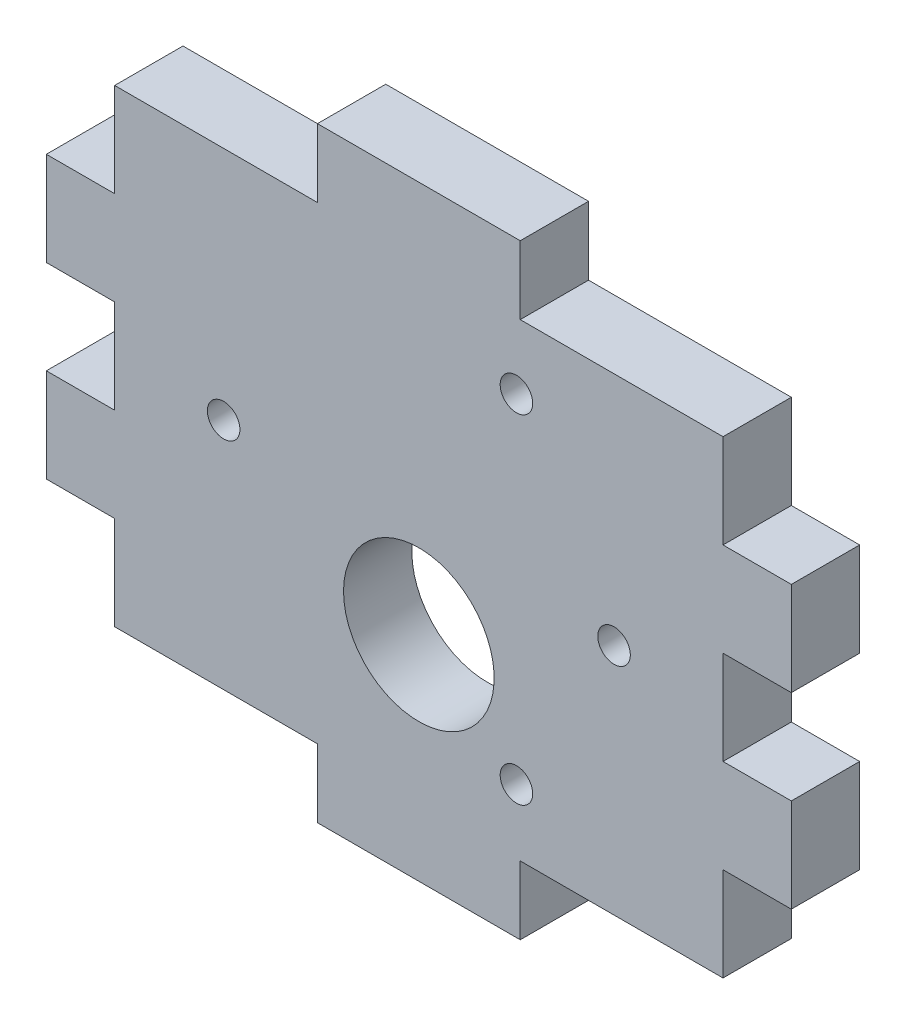
ISO-10303-21;
HEADER;
FILE_DESCRIPTION(('STEP AP214'),'2;1');
FILE_NAME('part.step','',(''),(''),'','','');
FILE_SCHEMA(('AUTOMOTIVE_DESIGN { 1 0 10303 214 1 1 1 1 }'));
ENDSEC;
DATA;
#1=APPLICATION_CONTEXT('core data for automotive mechanical design processes');
#2=APPLICATION_PROTOCOL_DEFINITION('international standard','automotive_design',2000,#1);
#3=PRODUCT_CONTEXT('',#1,'mechanical');
#4=PRODUCT('Part','Part','',(#3));
#5=PRODUCT_RELATED_PRODUCT_CATEGORY('part','',(#4));
#6=PRODUCT_DEFINITION_FORMATION('','',#4);
#7=PRODUCT_DEFINITION_CONTEXT('part definition',#1,'design');
#8=PRODUCT_DEFINITION('design','',#6,#7);
#9=PRODUCT_DEFINITION_SHAPE('','',#8);
#10=(LENGTH_UNIT() NAMED_UNIT(*) SI_UNIT(.MILLI.,.METRE.));
#11=(NAMED_UNIT(*) PLANE_ANGLE_UNIT() SI_UNIT($,.RADIAN.));
#12=(NAMED_UNIT(*) SI_UNIT($,.STERADIAN.) SOLID_ANGLE_UNIT());
#13=UNCERTAINTY_MEASURE_WITH_UNIT(LENGTH_MEASURE(1.E-05),#10,'distance_accuracy_value','');
#14=(GEOMETRIC_REPRESENTATION_CONTEXT(3) GLOBAL_UNCERTAINTY_ASSIGNED_CONTEXT((#13)) GLOBAL_UNIT_ASSIGNED_CONTEXT((#10,
#11,#12)) REPRESENTATION_CONTEXT('',''));
#15=CARTESIAN_POINT('',(0.,0.,0.));
#16=DIRECTION('',(0.,0.,1.));
#17=DIRECTION('',(1.,0.,0.));
#18=AXIS2_PLACEMENT_3D('',#15,#16,#17);
#19=CARTESIAN_POINT('',(-23.749,18.3007,2.667));
#20=DIRECTION('',(0.,-1.,0.));
#21=DIRECTION('',(0.,0.,-1.));
#22=AXIS2_PLACEMENT_3D('',#19,#20,#21);
#23=PLANE('',#22);
#24=DIRECTION('',(0.,0.,1.));
#25=VECTOR('',#24,1.);
#26=CARTESIAN_POINT('',(-7.91633333333333,18.3007,-2.667));
#27=LINE('',#26,#25);
#28=CARTESIAN_POINT('',(-7.91633333333333,18.3007,-2.667));
#29=VERTEX_POINT('',#28);
#30=CARTESIAN_POINT('',(-7.91633333333333,18.3007,2.667));
#31=VERTEX_POINT('',#30);
#32=EDGE_CURVE('E502',#29,#31,#27,.T.);
#33=ORIENTED_EDGE('',*,*,#32,.F.);
#34=DIRECTION('',(-1.,0.,0.));
#35=VECTOR('',#34,1.);
#36=CARTESIAN_POINT('',(-23.749,18.3007,-2.667));
#37=LINE('',#36,#35);
#38=CARTESIAN_POINT('',(-23.749,18.3007,-2.667));
#39=VERTEX_POINT('',#38);
#40=EDGE_CURVE('E243',#29,#39,#37,.T.);
#41=ORIENTED_EDGE('',*,*,#40,.T.);
#42=DIRECTION('',(0.,0.,-1.));
#43=VECTOR('',#42,1.);
#44=CARTESIAN_POINT('',(-23.749,18.3007,2.667));
#45=LINE('',#44,#43);
#46=CARTESIAN_POINT('',(-23.749,18.3007,2.667));
#47=VERTEX_POINT('',#46);
#48=EDGE_CURVE('E42',#47,#39,#45,.T.);
#49=ORIENTED_EDGE('',*,*,#48,.F.);
#50=DIRECTION('',(-1.,0.,0.));
#51=VECTOR('',#50,1.);
#52=CARTESIAN_POINT('',(-23.749,18.3007,2.667));
#53=LINE('',#52,#51);
#54=EDGE_CURVE('E319',#31,#47,#53,.T.);
#55=ORIENTED_EDGE('',*,*,#54,.F.);
#56=EDGE_LOOP('',(#33,#41,#49,#55));
#57=FACE_BOUND('',#56,.T.);
#58=ADVANCED_FACE('F33',(#57),#23,.F.);
#59=CARTESIAN_POINT('',(-23.749,-18.3007,2.667));
#60=DIRECTION('',(0.,1.,0.));
#61=DIRECTION('',(0.,0.,1.));
#62=AXIS2_PLACEMENT_3D('',#59,#60,#61);
#63=PLANE('',#62);
#64=DIRECTION('',(0.,0.,1.));
#65=VECTOR('',#64,1.);
#66=CARTESIAN_POINT('',(7.91633333333334,-18.3007,-2.667));
#67=LINE('',#66,#65);
#68=CARTESIAN_POINT('',(7.91633333333334,-18.3007,-2.667));
#69=VERTEX_POINT('',#68);
#70=CARTESIAN_POINT('',(7.91633333333334,-18.3007,2.667));
#71=VERTEX_POINT('',#70);
#72=EDGE_CURVE('E350',#69,#71,#67,.T.);
#73=ORIENTED_EDGE('',*,*,#72,.F.);
#74=DIRECTION('',(1.,0.,0.));
#75=VECTOR('',#74,1.);
#76=CARTESIAN_POINT('',(-23.749,-18.3007,-2.667));
#77=LINE('',#76,#75);
#78=CARTESIAN_POINT('',(23.749,-18.3007,-2.667));
#79=VERTEX_POINT('',#78);
#80=EDGE_CURVE('E271',#69,#79,#77,.T.);
#81=ORIENTED_EDGE('',*,*,#80,.T.);
#82=DIRECTION('',(0.,0.,-1.));
#83=VECTOR('',#82,1.);
#84=CARTESIAN_POINT('',(23.749,-18.3007,2.667));
#85=LINE('',#84,#83);
#86=CARTESIAN_POINT('',(23.749,-18.3007,2.667));
#87=VERTEX_POINT('',#86);
#88=EDGE_CURVE('E277',#87,#79,#85,.T.);
#89=ORIENTED_EDGE('',*,*,#88,.F.);
#90=DIRECTION('',(1.,0.,0.));
#91=VECTOR('',#90,1.);
#92=CARTESIAN_POINT('',(-23.749,-18.3007,2.667));
#93=LINE('',#92,#91);
#94=EDGE_CURVE('E285',#71,#87,#93,.T.);
#95=ORIENTED_EDGE('',*,*,#94,.F.);
#96=EDGE_LOOP('',(#73,#81,#89,#95));
#97=FACE_BOUND('',#96,.T.);
#98=ADVANCED_FACE('F348',(#97),#63,.F.);
#99=CARTESIAN_POINT('',(23.749,-18.3007,2.667));
#100=DIRECTION('',(-1.,0.,0.));
#101=DIRECTION('',(0.,0.,1.));
#102=AXIS2_PLACEMENT_3D('',#99,#100,#101);
#103=PLANE('',#102);
#104=DIRECTION('',(0.,1.,0.));
#105=VECTOR('',#104,1.);
#106=CARTESIAN_POINT('',(23.749,-18.3007,2.667));
#107=LINE('',#106,#105);
#108=CARTESIAN_POINT('',(23.749,10.98042,2.667));
#109=VERTEX_POINT('',#108);
#110=CARTESIAN_POINT('',(23.749,18.3007,2.667));
#111=VERTEX_POINT('',#110);
#112=EDGE_CURVE('E338',#109,#111,#107,.T.);
#113=ORIENTED_EDGE('',*,*,#112,.F.);
#114=DIRECTION('',(0.,0.,1.));
#115=VECTOR('',#114,1.);
#116=CARTESIAN_POINT('',(23.749,10.98042,-2.667));
#117=LINE('',#116,#115);
#118=CARTESIAN_POINT('',(23.749,10.98042,-2.667));
#119=VERTEX_POINT('',#118);
#120=EDGE_CURVE('E416',#119,#109,#117,.T.);
#121=ORIENTED_EDGE('',*,*,#120,.F.);
#122=DIRECTION('',(0.,1.,0.));
#123=VECTOR('',#122,1.);
#124=CARTESIAN_POINT('',(23.749,-18.3007,-2.667));
#125=LINE('',#124,#123);
#126=CARTESIAN_POINT('',(23.749,18.3007,-2.667));
#127=VERTEX_POINT('',#126);
#128=EDGE_CURVE('E325',#119,#127,#125,.T.);
#129=ORIENTED_EDGE('',*,*,#128,.T.);
#130=DIRECTION('',(0.,0.,-1.));
#131=VECTOR('',#130,1.);
#132=CARTESIAN_POINT('',(23.749,18.3007,2.667));
#133=LINE('',#132,#131);
#134=EDGE_CURVE('E11',#111,#127,#133,.T.);
#135=ORIENTED_EDGE('',*,*,#134,.F.);
#136=EDGE_LOOP('',(#113,#121,#129,#135));
#137=FACE_BOUND('',#136,.T.);
#138=ADVANCED_FACE('F474',(#137),#103,.F.);
#139=CARTESIAN_POINT('',(23.749,-3.66014,-2.667));
#140=VERTEX_POINT('',#139);
#141=CARTESIAN_POINT('',(23.749,3.66014,-2.667));
#142=VERTEX_POINT('',#141);
#143=EDGE_CURVE('E323',#140,#142,#125,.T.);
#144=ORIENTED_EDGE('',*,*,#143,.T.);
#145=DIRECTION('',(0.,0.,1.));
#146=VECTOR('',#145,1.);
#147=CARTESIAN_POINT('',(23.749,3.66014,-2.667));
#148=LINE('',#147,#146);
#149=CARTESIAN_POINT('',(23.749,3.66014,2.667));
#150=VERTEX_POINT('',#149);
#151=EDGE_CURVE('E407',#142,#150,#148,.T.);
#152=ORIENTED_EDGE('',*,*,#151,.T.);
#153=CARTESIAN_POINT('',(23.749,-3.66014,2.667));
#154=VERTEX_POINT('',#153);
#155=EDGE_CURVE('E329',#154,#150,#107,.T.);
#156=ORIENTED_EDGE('',*,*,#155,.F.);
#157=DIRECTION('',(0.,0.,1.));
#158=VECTOR('',#157,1.);
#159=CARTESIAN_POINT('',(23.749,-3.66014,-2.667));
#160=LINE('',#159,#158);
#161=EDGE_CURVE('E363',#140,#154,#160,.T.);
#162=ORIENTED_EDGE('',*,*,#161,.F.);
#163=EDGE_LOOP('',(#144,#152,#156,#162));
#164=FACE_BOUND('',#163,.T.);
#165=ADVANCED_FACE('F457',(#164),#103,.F.);
#166=CARTESIAN_POINT('',(-23.749,-18.3007,2.667));
#167=DIRECTION('',(1.,0.,0.));
#168=DIRECTION('',(0.,0.,-1.));
#169=AXIS2_PLACEMENT_3D('',#166,#167,#168);
#170=PLANE('',#169);
#171=DIRECTION('',(0.,-1.,0.));
#172=VECTOR('',#171,1.);
#173=CARTESIAN_POINT('',(-23.749,-18.3007,2.667));
#174=LINE('',#173,#172);
#175=CARTESIAN_POINT('',(-23.749,-10.98042,2.667));
#176=VERTEX_POINT('',#175);
#177=CARTESIAN_POINT('',(-23.749,-18.3007,2.667));
#178=VERTEX_POINT('',#177);
#179=EDGE_CURVE('E311',#176,#178,#174,.T.);
#180=ORIENTED_EDGE('',*,*,#179,.F.);
#181=DIRECTION('',(0.,0.,1.));
#182=VECTOR('',#181,1.);
#183=CARTESIAN_POINT('',(-23.749,-10.98042,-2.667));
#184=LINE('',#183,#182);
#185=CARTESIAN_POINT('',(-23.749,-10.98042,-2.667));
#186=VERTEX_POINT('',#185);
#187=EDGE_CURVE('E602',#186,#176,#184,.T.);
#188=ORIENTED_EDGE('',*,*,#187,.F.);
#189=DIRECTION('',(0.,-1.,0.));
#190=VECTOR('',#189,1.);
#191=CARTESIAN_POINT('',(-23.749,-18.3007,-2.667));
#192=LINE('',#191,#190);
#193=CARTESIAN_POINT('',(-23.749,-18.3007,-2.667));
#194=VERTEX_POINT('',#193);
#195=EDGE_CURVE('E242',#186,#194,#192,.T.);
#196=ORIENTED_EDGE('',*,*,#195,.T.);
#197=DIRECTION('',(0.,0.,-1.));
#198=VECTOR('',#197,1.);
#199=CARTESIAN_POINT('',(-23.749,-18.3007,2.667));
#200=LINE('',#199,#198);
#201=EDGE_CURVE('E275',#178,#194,#200,.T.);
#202=ORIENTED_EDGE('',*,*,#201,.F.);
#203=EDGE_LOOP('',(#180,#188,#196,#202));
#204=FACE_BOUND('',#203,.T.);
#205=ADVANCED_FACE('F586',(#204),#170,.F.);
#206=CARTESIAN_POINT('',(-23.749,3.66014,-2.667));
#207=VERTEX_POINT('',#206);
#208=CARTESIAN_POINT('',(-23.749,-3.66014,-2.667));
#209=VERTEX_POINT('',#208);
#210=EDGE_CURVE('E245',#207,#209,#192,.T.);
#211=ORIENTED_EDGE('',*,*,#210,.T.);
#212=DIRECTION('',(0.,0.,1.));
#213=VECTOR('',#212,1.);
#214=CARTESIAN_POINT('',(-23.749,-3.66014,-2.667));
#215=LINE('',#214,#213);
#216=CARTESIAN_POINT('',(-23.749,-3.66014,2.667));
#217=VERTEX_POINT('',#216);
#218=EDGE_CURVE('E627',#209,#217,#215,.T.);
#219=ORIENTED_EDGE('',*,*,#218,.T.);
#220=CARTESIAN_POINT('',(-23.749,3.66014,2.667));
#221=VERTEX_POINT('',#220);
#222=EDGE_CURVE('E304',#221,#217,#174,.T.);
#223=ORIENTED_EDGE('',*,*,#222,.F.);
#224=DIRECTION('',(0.,0.,1.));
#225=VECTOR('',#224,1.);
#226=CARTESIAN_POINT('',(-23.749,3.66014,-2.667));
#227=LINE('',#226,#225);
#228=EDGE_CURVE('E642',#207,#221,#227,.T.);
#229=ORIENTED_EDGE('',*,*,#228,.F.);
#230=EDGE_LOOP('',(#211,#219,#223,#229));
#231=FACE_BOUND('',#230,.T.);
#232=ADVANCED_FACE('F587',(#231),#170,.F.);
#233=CARTESIAN_POINT('',(23.749,-10.98042,-2.667));
#234=VERTEX_POINT('',#233);
#235=EDGE_CURVE('E247',#79,#234,#125,.T.);
#236=ORIENTED_EDGE('',*,*,#235,.T.);
#237=DIRECTION('',(0.,0.,1.));
#238=VECTOR('',#237,1.);
#239=CARTESIAN_POINT('',(23.749,-10.98042,-2.667));
#240=LINE('',#239,#238);
#241=CARTESIAN_POINT('',(23.749,-10.98042,2.667));
#242=VERTEX_POINT('',#241);
#243=EDGE_CURVE('E360',#234,#242,#240,.T.);
#244=ORIENTED_EDGE('',*,*,#243,.T.);
#245=EDGE_CURVE('E326',#87,#242,#107,.T.);
#246=ORIENTED_EDGE('',*,*,#245,.F.);
#247=ORIENTED_EDGE('',*,*,#88,.T.);
#248=EDGE_LOOP('',(#236,#244,#246,#247));
#249=FACE_BOUND('',#248,.T.);
#250=ADVANCED_FACE('F35',(#249),#103,.F.);
#251=CARTESIAN_POINT('',(7.91633333333334,18.3007,-2.667));
#252=VERTEX_POINT('',#251);
#253=EDGE_CURVE('E234',#127,#252,#37,.T.);
#254=ORIENTED_EDGE('',*,*,#253,.T.);
#255=DIRECTION('',(0.,0.,1.));
#256=VECTOR('',#255,1.);
#257=CARTESIAN_POINT('',(7.91633333333334,18.3007,-2.667));
#258=LINE('',#257,#256);
#259=CARTESIAN_POINT('',(7.91633333333331,18.3007,2.667));
#260=VERTEX_POINT('',#259);
#261=EDGE_CURVE('E218',#252,#260,#258,.T.);
#262=ORIENTED_EDGE('',*,*,#261,.T.);
#263=EDGE_CURVE('E316',#111,#260,#53,.T.);
#264=ORIENTED_EDGE('',*,*,#263,.F.);
#265=ORIENTED_EDGE('',*,*,#134,.T.);
#266=EDGE_LOOP('',(#254,#262,#264,#265));
#267=FACE_BOUND('',#266,.T.);
#268=ADVANCED_FACE('F240',(#267),#23,.F.);
#269=CARTESIAN_POINT('',(-23.749,10.98042,-2.667));
#270=VERTEX_POINT('',#269);
#271=EDGE_CURVE('E269',#39,#270,#192,.T.);
#272=ORIENTED_EDGE('',*,*,#271,.T.);
#273=DIRECTION('',(0.,0.,1.));
#274=VECTOR('',#273,1.);
#275=CARTESIAN_POINT('',(-23.749,10.98042,-2.667));
#276=LINE('',#275,#274);
#277=CARTESIAN_POINT('',(-23.749,10.98042,2.667));
#278=VERTEX_POINT('',#277);
#279=EDGE_CURVE('E648',#270,#278,#276,.T.);
#280=ORIENTED_EDGE('',*,*,#279,.T.);
#281=EDGE_CURVE('E289',#47,#278,#174,.T.);
#282=ORIENTED_EDGE('',*,*,#281,.F.);
#283=ORIENTED_EDGE('',*,*,#48,.T.);
#284=EDGE_LOOP('',(#272,#280,#282,#283));
#285=FACE_BOUND('',#284,.T.);
#286=ADVANCED_FACE('F570',(#285),#170,.F.);
#287=CARTESIAN_POINT('',(-7.91633333333333,-18.3007,-2.667));
#288=VERTEX_POINT('',#287);
#289=EDGE_CURVE('E340',#194,#288,#77,.T.);
#290=ORIENTED_EDGE('',*,*,#289,.T.);
#291=DIRECTION('',(0.,0.,1.));
#292=VECTOR('',#291,1.);
#293=CARTESIAN_POINT('',(-7.91633333333333,-18.3007,-2.667));
#294=LINE('',#293,#292);
#295=CARTESIAN_POINT('',(-7.91633333333334,-18.3007,2.667));
#296=VERTEX_POINT('',#295);
#297=EDGE_CURVE('E388',#288,#296,#294,.T.);
#298=ORIENTED_EDGE('',*,*,#297,.T.);
#299=EDGE_CURVE('E279',#178,#296,#93,.T.);
#300=ORIENTED_EDGE('',*,*,#299,.F.);
#301=ORIENTED_EDGE('',*,*,#201,.T.);
#302=EDGE_LOOP('',(#290,#298,#300,#301));
#303=FACE_BOUND('',#302,.T.);
#304=ADVANCED_FACE('F564',(#303),#63,.F.);
#305=CARTESIAN_POINT('',(23.749,18.3007,2.667));
#306=DIRECTION('',(0.,0.,-1.));
#307=DIRECTION('',(-1.,0.,0.));
#308=AXIS2_PLACEMENT_3D('',#305,#306,#307);
#309=PLANE('',#308);
#310=CARTESIAN_POINT('',(15.2399999999999,-0.0761999999999998,2.667));
#311=DIRECTION('',(0.,0.,-1.));
#312=DIRECTION('',(-1.,0.,0.));
#313=AXIS2_PLACEMENT_3D('',#310,#311,#312);
#314=CIRCLE('',#313,1.27);
#315=CARTESIAN_POINT('',(13.9699999999999,-0.0761999999999998,2.667));
#316=VERTEX_POINT('',#315);
#317=EDGE_CURVE('E534',#316,#316,#314,.T.);
#318=ORIENTED_EDGE('',*,*,#317,.T.);
#319=EDGE_LOOP('',(#318));
#320=FACE_BOUND('',#319,.T.);
#321=CARTESIAN_POINT('',(7.61999995005207,13.1220271825123,2.667));
#322=DIRECTION('',(0.,0.,-1.));
#323=DIRECTION('',(-1.,0.,0.));
#324=AXIS2_PLACEMENT_3D('',#321,#322,#323);
#325=CIRCLE('',#324,1.27);
#326=CARTESIAN_POINT('',(6.34999995005207,13.1220271825123,2.667));
#327=VERTEX_POINT('',#326);
#328=EDGE_CURVE('E528',#327,#327,#325,.T.);
#329=ORIENTED_EDGE('',*,*,#328,.T.);
#330=EDGE_LOOP('',(#329));
#331=FACE_BOUND('',#330,.T.);
#332=CARTESIAN_POINT('',(7.61999999999999,-13.274427096,2.667));
#333=DIRECTION('',(0.,0.,-1.));
#334=DIRECTION('',(-1.,0.,0.));
#335=AXIS2_PLACEMENT_3D('',#332,#333,#334);
#336=CIRCLE('',#335,1.27);
#337=CARTESIAN_POINT('',(6.35,-13.274427096,2.667));
#338=VERTEX_POINT('',#337);
#339=EDGE_CURVE('E522',#338,#338,#336,.T.);
#340=ORIENTED_EDGE('',*,*,#339,.T.);
#341=EDGE_LOOP('',(#340));
#342=FACE_BOUND('',#341,.T.);
#343=CARTESIAN_POINT('',(0.,-6.9596,2.667));
#344=DIRECTION('',(0.,0.,-1.));
#345=DIRECTION('',(-1.,0.,0.));
#346=AXIS2_PLACEMENT_3D('',#343,#344,#345);
#347=CIRCLE('',#346,5.8801);
#348=CARTESIAN_POINT('',(-5.88010000000007,-6.9596,2.667));
#349=VERTEX_POINT('',#348);
#350=EDGE_CURVE('E516',#349,#349,#347,.T.);
#351=ORIENTED_EDGE('',*,*,#350,.T.);
#352=EDGE_LOOP('',(#351));
#353=FACE_BOUND('',#352,.T.);
#354=CARTESIAN_POINT('',(-15.2400000000001,-0.0761999999999982,2.667));
#355=DIRECTION('',(0.,0.,-1.));
#356=DIRECTION('',(-1.,0.,0.));
#357=AXIS2_PLACEMENT_3D('',#354,#355,#356);
#358=CIRCLE('',#357,1.27);
#359=CARTESIAN_POINT('',(-16.5100000000001,-0.0761999999999982,2.667));
#360=VERTEX_POINT('',#359);
#361=EDGE_CURVE('E480',#360,#360,#358,.T.);
#362=ORIENTED_EDGE('',*,*,#361,.T.);
#363=EDGE_LOOP('',(#362));
#364=FACE_BOUND('',#363,.T.);
#365=ORIENTED_EDGE('',*,*,#245,.T.);
#366=DIRECTION('',(1.,0.,0.));
#367=VECTOR('',#366,1.);
#368=CARTESIAN_POINT('',(23.749,-10.98042,2.667));
#369=LINE('',#368,#367);
#370=CARTESIAN_POINT('',(29.083,-10.98042,2.667));
#371=VERTEX_POINT('',#370);
#372=EDGE_CURVE('E368',#242,#371,#369,.T.);
#373=ORIENTED_EDGE('',*,*,#372,.T.);
#374=DIRECTION('',(0.,1.,0.));
#375=VECTOR('',#374,1.);
#376=CARTESIAN_POINT('',(29.083,-10.98042,2.667));
#377=LINE('',#376,#375);
#378=CARTESIAN_POINT('',(29.083,-3.66014,2.667));
#379=VERTEX_POINT('',#378);
#380=EDGE_CURVE('E428',#371,#379,#377,.T.);
#381=ORIENTED_EDGE('',*,*,#380,.T.);
#382=DIRECTION('',(-1.,0.,0.));
#383=VECTOR('',#382,1.);
#384=CARTESIAN_POINT('',(23.749,-3.66014,2.667));
#385=LINE('',#384,#383);
#386=EDGE_CURVE('E430',#379,#154,#385,.T.);
#387=ORIENTED_EDGE('',*,*,#386,.T.);
#388=ORIENTED_EDGE('',*,*,#155,.T.);
#389=DIRECTION('',(1.,0.,0.));
#390=VECTOR('',#389,1.);
#391=CARTESIAN_POINT('',(23.749,3.66014,2.667));
#392=LINE('',#391,#390);
#393=CARTESIAN_POINT('',(29.083,3.66013999999999,2.667));
#394=VERTEX_POINT('',#393);
#395=EDGE_CURVE('E408',#150,#394,#392,.T.);
#396=ORIENTED_EDGE('',*,*,#395,.T.);
#397=DIRECTION('',(0.,1.,0.));
#398=VECTOR('',#397,1.);
#399=CARTESIAN_POINT('',(29.083,10.98042,2.667));
#400=LINE('',#399,#398);
#401=CARTESIAN_POINT('',(29.083,10.98042,2.667));
#402=VERTEX_POINT('',#401);
#403=EDGE_CURVE('E411',#394,#402,#400,.T.);
#404=ORIENTED_EDGE('',*,*,#403,.T.);
#405=DIRECTION('',(-1.,0.,0.));
#406=VECTOR('',#405,1.);
#407=CARTESIAN_POINT('',(23.749,10.98042,2.667));
#408=LINE('',#407,#406);
#409=EDGE_CURVE('E401',#402,#109,#408,.T.);
#410=ORIENTED_EDGE('',*,*,#409,.T.);
#411=ORIENTED_EDGE('',*,*,#112,.T.);
#412=ORIENTED_EDGE('',*,*,#263,.T.);
#413=DIRECTION('',(0.,1.,0.));
#414=VECTOR('',#413,1.);
#415=CARTESIAN_POINT('',(7.91633333333334,18.3007,2.667));
#416=LINE('',#415,#414);
#417=CARTESIAN_POINT('',(7.91633333333334,23.6347,2.667));
#418=VERTEX_POINT('',#417);
#419=EDGE_CURVE('E50',#260,#418,#416,.T.);
#420=ORIENTED_EDGE('',*,*,#419,.T.);
#421=DIRECTION('',(-1.,0.,0.));
#422=VECTOR('',#421,1.);
#423=CARTESIAN_POINT('',(-7.91633333333333,23.6347,2.667));
#424=LINE('',#423,#422);
#425=CARTESIAN_POINT('',(-7.91633333333333,23.6347,2.667));
#426=VERTEX_POINT('',#425);
#427=EDGE_CURVE('E478',#418,#426,#424,.T.);
#428=ORIENTED_EDGE('',*,*,#427,.T.);
#429=DIRECTION('',(0.,-1.,0.));
#430=VECTOR('',#429,1.);
#431=CARTESIAN_POINT('',(-7.91633333333333,18.3007,2.667));
#432=LINE('',#431,#430);
#433=EDGE_CURVE('E238',#426,#31,#432,.T.);
#434=ORIENTED_EDGE('',*,*,#433,.T.);
#435=ORIENTED_EDGE('',*,*,#54,.T.);
#436=ORIENTED_EDGE('',*,*,#281,.T.);
#437=DIRECTION('',(-1.,0.,0.));
#438=VECTOR('',#437,1.);
#439=CARTESIAN_POINT('',(-23.749,10.98042,2.667));
#440=LINE('',#439,#438);
#441=CARTESIAN_POINT('',(-29.083,10.98042,2.667));
#442=VERTEX_POINT('',#441);
#443=EDGE_CURVE('E610',#278,#442,#440,.T.);
#444=ORIENTED_EDGE('',*,*,#443,.T.);
#445=DIRECTION('',(0.,-1.,0.));
#446=VECTOR('',#445,1.);
#447=CARTESIAN_POINT('',(-29.083,10.98042,2.667));
#448=LINE('',#447,#446);
#449=CARTESIAN_POINT('',(-29.083,3.66013999999999,2.667));
#450=VERTEX_POINT('',#449);
#451=EDGE_CURVE('E634',#442,#450,#448,.T.);
#452=ORIENTED_EDGE('',*,*,#451,.T.);
#453=DIRECTION('',(1.,0.,0.));
#454=VECTOR('',#453,1.);
#455=CARTESIAN_POINT('',(-23.749,3.66014,2.667));
#456=LINE('',#455,#454);
#457=EDGE_CURVE('E637',#450,#221,#456,.T.);
#458=ORIENTED_EDGE('',*,*,#457,.T.);
#459=ORIENTED_EDGE('',*,*,#222,.T.);
#460=DIRECTION('',(-1.,0.,0.));
#461=VECTOR('',#460,1.);
#462=CARTESIAN_POINT('',(-23.749,-3.66014,2.667));
#463=LINE('',#462,#461);
#464=CARTESIAN_POINT('',(-29.083,-3.66014,2.667));
#465=VERTEX_POINT('',#464);
#466=EDGE_CURVE('E362',#217,#465,#463,.T.);
#467=ORIENTED_EDGE('',*,*,#466,.T.);
#468=DIRECTION('',(0.,-1.,0.));
#469=VECTOR('',#468,1.);
#470=CARTESIAN_POINT('',(-29.083,-10.98042,2.667));
#471=LINE('',#470,#469);
#472=CARTESIAN_POINT('',(-29.083,-10.98042,2.667));
#473=VERTEX_POINT('',#472);
#474=EDGE_CURVE('E615',#465,#473,#471,.T.);
#475=ORIENTED_EDGE('',*,*,#474,.T.);
#476=DIRECTION('',(1.,0.,0.));
#477=VECTOR('',#476,1.);
#478=CARTESIAN_POINT('',(-23.749,-10.98042,2.667));
#479=LINE('',#478,#477);
#480=EDGE_CURVE('E607',#473,#176,#479,.T.);
#481=ORIENTED_EDGE('',*,*,#480,.T.);
#482=ORIENTED_EDGE('',*,*,#179,.T.);
#483=ORIENTED_EDGE('',*,*,#299,.T.);
#484=DIRECTION('',(0.,-1.,0.));
#485=VECTOR('',#484,1.);
#486=CARTESIAN_POINT('',(-7.91633333333333,-18.3007,2.667));
#487=LINE('',#486,#485);
#488=CARTESIAN_POINT('',(-7.91633333333333,-23.6347,2.667));
#489=VERTEX_POINT('',#488);
#490=EDGE_CURVE('E58',#296,#489,#487,.T.);
#491=ORIENTED_EDGE('',*,*,#490,.T.);
#492=DIRECTION('',(1.,0.,0.));
#493=VECTOR('',#492,1.);
#494=CARTESIAN_POINT('',(-7.91633333333333,-23.6347,2.667));
#495=LINE('',#494,#493);
#496=CARTESIAN_POINT('',(7.91633333333334,-23.6347,2.667));
#497=VERTEX_POINT('',#496);
#498=EDGE_CURVE('E374',#489,#497,#495,.T.);
#499=ORIENTED_EDGE('',*,*,#498,.T.);
#500=DIRECTION('',(0.,1.,0.));
#501=VECTOR('',#500,1.);
#502=CARTESIAN_POINT('',(7.91633333333334,-18.3007,2.667));
#503=LINE('',#502,#501);
#504=EDGE_CURVE('E372',#497,#71,#503,.T.);
#505=ORIENTED_EDGE('',*,*,#504,.T.);
#506=ORIENTED_EDGE('',*,*,#94,.T.);
#507=EDGE_LOOP('',(#365,#373,#381,#387,#388,#396,#404,#410,#411,#412,#420,#428,#434,#435,#436,
#444,#452,#458,#459,#467,#475,#481,#482,#483,#491,#499,#505,#506));
#508=FACE_BOUND('',#507,.T.);
#509=ADVANCED_FACE('F366',(#320,#331,#342,#353,#364,#508),#309,.F.);
#510=CARTESIAN_POINT('',(23.749,18.3007,-2.667));
#511=DIRECTION('',(0.,0.,-1.));
#512=DIRECTION('',(-1.,0.,0.));
#513=AXIS2_PLACEMENT_3D('',#510,#511,#512);
#514=PLANE('',#513);
#515=CARTESIAN_POINT('',(15.2399999999999,-0.0761999999999998,-2.667));
#516=DIRECTION('',(0.,0.,-1.));
#517=DIRECTION('',(-1.,0.,0.));
#518=AXIS2_PLACEMENT_3D('',#515,#516,#517);
#519=CIRCLE('',#518,1.27);
#520=CARTESIAN_POINT('',(13.9699999999999,-0.0761999999999998,-2.667));
#521=VERTEX_POINT('',#520);
#522=EDGE_CURVE('E537',#521,#521,#519,.T.);
#523=ORIENTED_EDGE('',*,*,#522,.F.);
#524=EDGE_LOOP('',(#523));
#525=FACE_BOUND('',#524,.T.);
#526=CARTESIAN_POINT('',(7.61999995005207,13.1220271825123,-2.667));
#527=DIRECTION('',(0.,0.,-1.));
#528=DIRECTION('',(-1.,0.,0.));
#529=AXIS2_PLACEMENT_3D('',#526,#527,#528);
#530=CIRCLE('',#529,1.27);
#531=CARTESIAN_POINT('',(6.34999995005207,13.1220271825123,-2.667));
#532=VERTEX_POINT('',#531);
#533=EDGE_CURVE('E531',#532,#532,#530,.T.);
#534=ORIENTED_EDGE('',*,*,#533,.F.);
#535=EDGE_LOOP('',(#534));
#536=FACE_BOUND('',#535,.T.);
#537=CARTESIAN_POINT('',(7.61999999999999,-13.274427096,-2.667));
#538=DIRECTION('',(0.,0.,-1.));
#539=DIRECTION('',(-1.,0.,0.));
#540=AXIS2_PLACEMENT_3D('',#537,#538,#539);
#541=CIRCLE('',#540,1.27);
#542=CARTESIAN_POINT('',(6.35,-13.274427096,-2.667));
#543=VERTEX_POINT('',#542);
#544=EDGE_CURVE('E525',#543,#543,#541,.T.);
#545=ORIENTED_EDGE('',*,*,#544,.F.);
#546=EDGE_LOOP('',(#545));
#547=FACE_BOUND('',#546,.T.);
#548=CARTESIAN_POINT('',(0.,-6.9596,-2.667));
#549=DIRECTION('',(0.,0.,-1.));
#550=DIRECTION('',(-1.,0.,0.));
#551=AXIS2_PLACEMENT_3D('',#548,#549,#550);
#552=CIRCLE('',#551,5.8801);
#553=CARTESIAN_POINT('',(-5.88010000000007,-6.9596,-2.667));
#554=VERTEX_POINT('',#553);
#555=EDGE_CURVE('E519',#554,#554,#552,.T.);
#556=ORIENTED_EDGE('',*,*,#555,.F.);
#557=EDGE_LOOP('',(#556));
#558=FACE_BOUND('',#557,.T.);
#559=CARTESIAN_POINT('',(-15.2400000000001,-0.0761999999999982,-2.667));
#560=DIRECTION('',(0.,0.,-1.));
#561=DIRECTION('',(-1.,0.,0.));
#562=AXIS2_PLACEMENT_3D('',#559,#560,#561);
#563=CIRCLE('',#562,1.27);
#564=CARTESIAN_POINT('',(-16.5100000000001,-0.0761999999999982,-2.667));
#565=VERTEX_POINT('',#564);
#566=EDGE_CURVE('E484',#565,#565,#563,.T.);
#567=ORIENTED_EDGE('',*,*,#566,.F.);
#568=EDGE_LOOP('',(#567));
#569=FACE_BOUND('',#568,.T.);
#570=ORIENTED_EDGE('',*,*,#235,.F.);
#571=ORIENTED_EDGE('',*,*,#80,.F.);
#572=DIRECTION('',(0.,1.,0.));
#573=VECTOR('',#572,1.);
#574=CARTESIAN_POINT('',(7.91633333333334,-18.3007,-2.667));
#575=LINE('',#574,#573);
#576=CARTESIAN_POINT('',(7.91633333333334,-23.6347,-2.667));
#577=VERTEX_POINT('',#576);
#578=EDGE_CURVE('E353',#577,#69,#575,.T.);
#579=ORIENTED_EDGE('',*,*,#578,.F.);
#580=DIRECTION('',(1.,0.,0.));
#581=VECTOR('',#580,1.);
#582=CARTESIAN_POINT('',(-7.91633333333333,-23.6347,-2.667));
#583=LINE('',#582,#581);
#584=CARTESIAN_POINT('',(-7.91633333333333,-23.6347,-2.667));
#585=VERTEX_POINT('',#584);
#586=EDGE_CURVE('E378',#585,#577,#583,.T.);
#587=ORIENTED_EDGE('',*,*,#586,.F.);
#588=DIRECTION('',(0.,-1.,0.));
#589=VECTOR('',#588,1.);
#590=CARTESIAN_POINT('',(-7.91633333333333,-18.3007,-2.667));
#591=LINE('',#590,#589);
#592=EDGE_CURVE('E376',#288,#585,#591,.T.);
#593=ORIENTED_EDGE('',*,*,#592,.F.);
#594=ORIENTED_EDGE('',*,*,#289,.F.);
#595=ORIENTED_EDGE('',*,*,#195,.F.);
#596=DIRECTION('',(1.,0.,0.));
#597=VECTOR('',#596,1.);
#598=CARTESIAN_POINT('',(-23.749,-10.98042,-2.667));
#599=LINE('',#598,#597);
#600=CARTESIAN_POINT('',(-29.083,-10.98042,-2.667));
#601=VERTEX_POINT('',#600);
#602=EDGE_CURVE('E609',#601,#186,#599,.T.);
#603=ORIENTED_EDGE('',*,*,#602,.F.);
#604=DIRECTION('',(0.,-1.,0.));
#605=VECTOR('',#604,1.);
#606=CARTESIAN_POINT('',(-29.083,-10.98042,-2.667));
#607=LINE('',#606,#605);
#608=CARTESIAN_POINT('',(-29.083,-3.66014,-2.667));
#609=VERTEX_POINT('',#608);
#610=EDGE_CURVE('E619',#609,#601,#607,.T.);
#611=ORIENTED_EDGE('',*,*,#610,.F.);
#612=DIRECTION('',(-1.,0.,0.));
#613=VECTOR('',#612,1.);
#614=CARTESIAN_POINT('',(-23.749,-3.66014,-2.667));
#615=LINE('',#614,#613);
#616=EDGE_CURVE('E616',#209,#609,#615,.T.);
#617=ORIENTED_EDGE('',*,*,#616,.F.);
#618=ORIENTED_EDGE('',*,*,#210,.F.);
#619=DIRECTION('',(1.,0.,0.));
#620=VECTOR('',#619,1.);
#621=CARTESIAN_POINT('',(-23.749,3.66014,-2.667));
#622=LINE('',#621,#620);
#623=CARTESIAN_POINT('',(-29.083,3.66013999999999,-2.667));
#624=VERTEX_POINT('',#623);
#625=EDGE_CURVE('E632',#624,#207,#622,.T.);
#626=ORIENTED_EDGE('',*,*,#625,.F.);
#627=DIRECTION('',(0.,-1.,0.));
#628=VECTOR('',#627,1.);
#629=CARTESIAN_POINT('',(-29.083,10.98042,-2.667));
#630=LINE('',#629,#628);
#631=CARTESIAN_POINT('',(-29.083,10.98042,-2.667));
#632=VERTEX_POINT('',#631);
#633=EDGE_CURVE('E629',#632,#624,#630,.T.);
#634=ORIENTED_EDGE('',*,*,#633,.F.);
#635=DIRECTION('',(-1.,0.,0.));
#636=VECTOR('',#635,1.);
#637=CARTESIAN_POINT('',(-23.749,10.98042,-2.667));
#638=LINE('',#637,#636);
#639=EDGE_CURVE('E633',#270,#632,#638,.T.);
#640=ORIENTED_EDGE('',*,*,#639,.F.);
#641=ORIENTED_EDGE('',*,*,#271,.F.);
#642=ORIENTED_EDGE('',*,*,#40,.F.);
#643=DIRECTION('',(0.,-1.,0.));
#644=VECTOR('',#643,1.);
#645=CARTESIAN_POINT('',(-7.91633333333333,18.3007,-2.667));
#646=LINE('',#645,#644);
#647=CARTESIAN_POINT('',(-7.91633333333333,23.6347,-2.667));
#648=VERTEX_POINT('',#647);
#649=EDGE_CURVE('E227',#648,#29,#646,.T.);
#650=ORIENTED_EDGE('',*,*,#649,.F.);
#651=DIRECTION('',(-1.,0.,0.));
#652=VECTOR('',#651,1.);
#653=CARTESIAN_POINT('',(-7.91633333333333,23.6347,-2.667));
#654=LINE('',#653,#652);
#655=CARTESIAN_POINT('',(7.91633333333334,23.6347,-2.667));
#656=VERTEX_POINT('',#655);
#657=EDGE_CURVE('E237',#656,#648,#654,.T.);
#658=ORIENTED_EDGE('',*,*,#657,.F.);
#659=DIRECTION('',(0.,1.,0.));
#660=VECTOR('',#659,1.);
#661=CARTESIAN_POINT('',(7.91633333333334,18.3007,-2.667));
#662=LINE('',#661,#660);
#663=EDGE_CURVE('E221',#252,#656,#662,.T.);
#664=ORIENTED_EDGE('',*,*,#663,.F.);
#665=ORIENTED_EDGE('',*,*,#253,.F.);
#666=ORIENTED_EDGE('',*,*,#128,.F.);
#667=DIRECTION('',(-1.,0.,0.));
#668=VECTOR('',#667,1.);
#669=CARTESIAN_POINT('',(23.749,10.98042,-2.667));
#670=LINE('',#669,#668);
#671=CARTESIAN_POINT('',(29.083,10.98042,-2.667));
#672=VERTEX_POINT('',#671);
#673=EDGE_CURVE('E404',#672,#119,#670,.T.);
#674=ORIENTED_EDGE('',*,*,#673,.F.);
#675=DIRECTION('',(0.,1.,0.));
#676=VECTOR('',#675,1.);
#677=CARTESIAN_POINT('',(29.083,10.98042,-2.667));
#678=LINE('',#677,#676);
#679=CARTESIAN_POINT('',(29.083,3.66013999999999,-2.667));
#680=VERTEX_POINT('',#679);
#681=EDGE_CURVE('E400',#680,#672,#678,.T.);
#682=ORIENTED_EDGE('',*,*,#681,.F.);
#683=DIRECTION('',(1.,0.,0.));
#684=VECTOR('',#683,1.);
#685=CARTESIAN_POINT('',(23.749,3.66014,-2.667));
#686=LINE('',#685,#684);
#687=EDGE_CURVE('E397',#142,#680,#686,.T.);
#688=ORIENTED_EDGE('',*,*,#687,.F.);
#689=ORIENTED_EDGE('',*,*,#143,.F.);
#690=DIRECTION('',(-1.,0.,0.));
#691=VECTOR('',#690,1.);
#692=CARTESIAN_POINT('',(23.749,-3.66014,-2.667));
#693=LINE('',#692,#691);
#694=CARTESIAN_POINT('',(29.083,-3.66014,-2.667));
#695=VERTEX_POINT('',#694);
#696=EDGE_CURVE('E427',#695,#140,#693,.T.);
#697=ORIENTED_EDGE('',*,*,#696,.F.);
#698=DIRECTION('',(0.,1.,0.));
#699=VECTOR('',#698,1.);
#700=CARTESIAN_POINT('',(29.083,-10.98042,-2.667));
#701=LINE('',#700,#699);
#702=CARTESIAN_POINT('',(29.083,-10.98042,-2.667));
#703=VERTEX_POINT('',#702);
#704=EDGE_CURVE('E424',#703,#695,#701,.T.);
#705=ORIENTED_EDGE('',*,*,#704,.F.);
#706=DIRECTION('',(1.,0.,0.));
#707=VECTOR('',#706,1.);
#708=CARTESIAN_POINT('',(23.749,-10.98042,-2.667));
#709=LINE('',#708,#707);
#710=EDGE_CURVE('E358',#234,#703,#709,.T.);
#711=ORIENTED_EDGE('',*,*,#710,.F.);
#712=EDGE_LOOP('',(#570,#571,#579,#587,#593,#594,#595,#603,#611,#617,#618,#626,#634,#640,#641,
#642,#650,#658,#664,#665,#666,#674,#682,#688,#689,#697,#705,#711));
#713=FACE_BOUND('',#712,.T.);
#714=ADVANCED_FACE('F233',(#525,#536,#547,#558,#569,#713),#514,.T.);
#715=CARTESIAN_POINT('',(-23.749,3.66014,-2.667));
#716=DIRECTION('',(0.,-1.,0.));
#717=DIRECTION('',(1.,0.,0.));
#718=AXIS2_PLACEMENT_3D('',#715,#716,#717);
#719=PLANE('',#718);
#720=ORIENTED_EDGE('',*,*,#457,.F.);
#721=DIRECTION('',(0.,0.,1.));
#722=VECTOR('',#721,1.);
#723=CARTESIAN_POINT('',(-29.083,3.66013999999999,-2.667));
#724=LINE('',#723,#722);
#725=EDGE_CURVE('E640',#624,#450,#724,.T.);
#726=ORIENTED_EDGE('',*,*,#725,.F.);
#727=ORIENTED_EDGE('',*,*,#625,.T.);
#728=ORIENTED_EDGE('',*,*,#228,.T.);
#729=EDGE_LOOP('',(#720,#726,#727,#728));
#730=FACE_BOUND('',#729,.T.);
#731=ADVANCED_FACE('F546',(#730),#719,.T.);
#732=CARTESIAN_POINT('',(-29.083,10.98042,-2.667));
#733=DIRECTION('',(-1.,0.,0.));
#734=DIRECTION('',(0.,0.,1.));
#735=AXIS2_PLACEMENT_3D('',#732,#733,#734);
#736=PLANE('',#735);
#737=ORIENTED_EDGE('',*,*,#451,.F.);
#738=DIRECTION('',(0.,0.,1.));
#739=VECTOR('',#738,1.);
#740=CARTESIAN_POINT('',(-29.083,10.98042,-2.667));
#741=LINE('',#740,#739);
#742=EDGE_CURVE('E659',#632,#442,#741,.T.);
#743=ORIENTED_EDGE('',*,*,#742,.F.);
#744=ORIENTED_EDGE('',*,*,#633,.T.);
#745=ORIENTED_EDGE('',*,*,#725,.T.);
#746=EDGE_LOOP('',(#737,#743,#744,#745));
#747=FACE_BOUND('',#746,.T.);
#748=ADVANCED_FACE('F670',(#747),#736,.T.);
#749=CARTESIAN_POINT('',(-23.749,10.98042,-2.667));
#750=DIRECTION('',(0.,1.,0.));
#751=DIRECTION('',(0.,0.,1.));
#752=AXIS2_PLACEMENT_3D('',#749,#750,#751);
#753=PLANE('',#752);
#754=ORIENTED_EDGE('',*,*,#443,.F.);
#755=ORIENTED_EDGE('',*,*,#279,.F.);
#756=ORIENTED_EDGE('',*,*,#639,.T.);
#757=ORIENTED_EDGE('',*,*,#742,.T.);
#758=EDGE_LOOP('',(#754,#755,#756,#757));
#759=FACE_BOUND('',#758,.T.);
#760=ADVANCED_FACE('F662',(#759),#753,.T.);
#761=CARTESIAN_POINT('',(-23.749,-10.98042,-2.667));
#762=DIRECTION('',(0.,-1.,0.));
#763=DIRECTION('',(0.,0.,-1.));
#764=AXIS2_PLACEMENT_3D('',#761,#762,#763);
#765=PLANE('',#764);
#766=ORIENTED_EDGE('',*,*,#480,.F.);
#767=DIRECTION('',(0.,0.,1.));
#768=VECTOR('',#767,1.);
#769=CARTESIAN_POINT('',(-29.083,-10.98042,-2.667));
#770=LINE('',#769,#768);
#771=EDGE_CURVE('E611',#601,#473,#770,.T.);
#772=ORIENTED_EDGE('',*,*,#771,.F.);
#773=ORIENTED_EDGE('',*,*,#602,.T.);
#774=ORIENTED_EDGE('',*,*,#187,.T.);
#775=EDGE_LOOP('',(#766,#772,#773,#774));
#776=FACE_BOUND('',#775,.T.);
#777=ADVANCED_FACE('F606',(#776),#765,.T.);
#778=CARTESIAN_POINT('',(-29.083,-10.98042,-2.667));
#779=DIRECTION('',(-1.,0.,0.));
#780=DIRECTION('',(0.,0.,1.));
#781=AXIS2_PLACEMENT_3D('',#778,#779,#780);
#782=PLANE('',#781);
#783=ORIENTED_EDGE('',*,*,#474,.F.);
#784=DIRECTION('',(0.,0.,1.));
#785=VECTOR('',#784,1.);
#786=CARTESIAN_POINT('',(-29.083,-3.66014,-2.667));
#787=LINE('',#786,#785);
#788=EDGE_CURVE('E625',#609,#465,#787,.T.);
#789=ORIENTED_EDGE('',*,*,#788,.F.);
#790=ORIENTED_EDGE('',*,*,#610,.T.);
#791=ORIENTED_EDGE('',*,*,#771,.T.);
#792=EDGE_LOOP('',(#783,#789,#790,#791));
#793=FACE_BOUND('',#792,.T.);
#794=ADVANCED_FACE('F693',(#793),#782,.T.);
#795=CARTESIAN_POINT('',(-23.749,-3.66014,-2.667));
#796=DIRECTION('',(0.,1.,0.));
#797=DIRECTION('',(-1.,0.,0.));
#798=AXIS2_PLACEMENT_3D('',#795,#796,#797);
#799=PLANE('',#798);
#800=ORIENTED_EDGE('',*,*,#466,.F.);
#801=ORIENTED_EDGE('',*,*,#218,.F.);
#802=ORIENTED_EDGE('',*,*,#616,.T.);
#803=ORIENTED_EDGE('',*,*,#788,.T.);
#804=EDGE_LOOP('',(#800,#801,#802,#803));
#805=FACE_BOUND('',#804,.T.);
#806=ADVANCED_FACE('F678',(#805),#799,.T.);
#807=CARTESIAN_POINT('',(23.749,-10.98042,-2.667));
#808=DIRECTION('',(0.,-1.,0.));
#809=DIRECTION('',(0.,0.,-1.));
#810=AXIS2_PLACEMENT_3D('',#807,#808,#809);
#811=PLANE('',#810);
#812=ORIENTED_EDGE('',*,*,#372,.F.);
#813=ORIENTED_EDGE('',*,*,#243,.F.);
#814=ORIENTED_EDGE('',*,*,#710,.T.);
#815=DIRECTION('',(0.,0.,1.));
#816=VECTOR('',#815,1.);
#817=CARTESIAN_POINT('',(29.083,-10.98042,-2.667));
#818=LINE('',#817,#816);
#819=EDGE_CURVE('E444',#703,#371,#818,.T.);
#820=ORIENTED_EDGE('',*,*,#819,.T.);
#821=EDGE_LOOP('',(#812,#813,#814,#820));
#822=FACE_BOUND('',#821,.T.);
#823=ADVANCED_FACE('F685',(#822),#811,.T.);
#824=CARTESIAN_POINT('',(23.749,-3.66014,-2.667));
#825=DIRECTION('',(0.,1.,0.));
#826=DIRECTION('',(-1.,0.,0.));
#827=AXIS2_PLACEMENT_3D('',#824,#825,#826);
#828=PLANE('',#827);
#829=ORIENTED_EDGE('',*,*,#386,.F.);
#830=DIRECTION('',(0.,0.,1.));
#831=VECTOR('',#830,1.);
#832=CARTESIAN_POINT('',(29.083,-3.66014,-2.667));
#833=LINE('',#832,#831);
#834=EDGE_CURVE('E442',#695,#379,#833,.T.);
#835=ORIENTED_EDGE('',*,*,#834,.F.);
#836=ORIENTED_EDGE('',*,*,#696,.T.);
#837=ORIENTED_EDGE('',*,*,#161,.T.);
#838=EDGE_LOOP('',(#829,#835,#836,#837));
#839=FACE_BOUND('',#838,.T.);
#840=ADVANCED_FACE('F684',(#839),#828,.T.);
#841=CARTESIAN_POINT('',(29.083,-10.98042,-2.667));
#842=DIRECTION('',(1.,0.,0.));
#843=DIRECTION('',(0.,0.,-1.));
#844=AXIS2_PLACEMENT_3D('',#841,#842,#843);
#845=PLANE('',#844);
#846=ORIENTED_EDGE('',*,*,#380,.F.);
#847=ORIENTED_EDGE('',*,*,#819,.F.);
#848=ORIENTED_EDGE('',*,*,#704,.T.);
#849=ORIENTED_EDGE('',*,*,#834,.T.);
#850=EDGE_LOOP('',(#846,#847,#848,#849));
#851=FACE_BOUND('',#850,.T.);
#852=ADVANCED_FACE('F683',(#851),#845,.T.);
#853=CARTESIAN_POINT('',(23.749,10.98042,-2.667));
#854=DIRECTION('',(0.,1.,0.));
#855=DIRECTION('',(0.,0.,1.));
#856=AXIS2_PLACEMENT_3D('',#853,#854,#855);
#857=PLANE('',#856);
#858=ORIENTED_EDGE('',*,*,#409,.F.);
#859=DIRECTION('',(0.,0.,1.));
#860=VECTOR('',#859,1.);
#861=CARTESIAN_POINT('',(29.083,10.98042,-2.667));
#862=LINE('',#861,#860);
#863=EDGE_CURVE('E419',#672,#402,#862,.T.);
#864=ORIENTED_EDGE('',*,*,#863,.F.);
#865=ORIENTED_EDGE('',*,*,#673,.T.);
#866=ORIENTED_EDGE('',*,*,#120,.T.);
#867=EDGE_LOOP('',(#858,#864,#865,#866));
#868=FACE_BOUND('',#867,.T.);
#869=ADVANCED_FACE('F471',(#868),#857,.T.);
#870=CARTESIAN_POINT('',(29.083,10.98042,-2.667));
#871=DIRECTION('',(1.,0.,0.));
#872=DIRECTION('',(0.,0.,-1.));
#873=AXIS2_PLACEMENT_3D('',#870,#871,#872);
#874=PLANE('',#873);
#875=ORIENTED_EDGE('',*,*,#403,.F.);
#876=DIRECTION('',(0.,0.,1.));
#877=VECTOR('',#876,1.);
#878=CARTESIAN_POINT('',(29.083,3.66013999999999,-2.667));
#879=LINE('',#878,#877);
#880=EDGE_CURVE('E421',#680,#394,#879,.T.);
#881=ORIENTED_EDGE('',*,*,#880,.F.);
#882=ORIENTED_EDGE('',*,*,#681,.T.);
#883=ORIENTED_EDGE('',*,*,#863,.T.);
#884=EDGE_LOOP('',(#875,#881,#882,#883));
#885=FACE_BOUND('',#884,.T.);
#886=ADVANCED_FACE('F468',(#885),#874,.T.);
#887=CARTESIAN_POINT('',(23.749,3.66014,-2.667));
#888=DIRECTION('',(0.,-1.,0.));
#889=DIRECTION('',(1.,0.,0.));
#890=AXIS2_PLACEMENT_3D('',#887,#888,#889);
#891=PLANE('',#890);
#892=ORIENTED_EDGE('',*,*,#395,.F.);
#893=ORIENTED_EDGE('',*,*,#151,.F.);
#894=ORIENTED_EDGE('',*,*,#687,.T.);
#895=ORIENTED_EDGE('',*,*,#880,.T.);
#896=EDGE_LOOP('',(#892,#893,#894,#895));
#897=FACE_BOUND('',#896,.T.);
#898=ADVANCED_FACE('F462',(#897),#891,.T.);
#899=CARTESIAN_POINT('',(-7.91633333333333,-18.3007,-2.667));
#900=DIRECTION('',(-1.,0.,0.));
#901=DIRECTION('',(0.,0.,1.));
#902=AXIS2_PLACEMENT_3D('',#899,#900,#901);
#903=PLANE('',#902);
#904=ORIENTED_EDGE('',*,*,#490,.F.);
#905=ORIENTED_EDGE('',*,*,#297,.F.);
#906=ORIENTED_EDGE('',*,*,#592,.T.);
#907=DIRECTION('',(0.,0.,1.));
#908=VECTOR('',#907,1.);
#909=CARTESIAN_POINT('',(-7.91633333333333,-23.6347,-2.667));
#910=LINE('',#909,#908);
#911=EDGE_CURVE('E385',#585,#489,#910,.T.);
#912=ORIENTED_EDGE('',*,*,#911,.T.);
#913=EDGE_LOOP('',(#904,#905,#906,#912));
#914=FACE_BOUND('',#913,.T.);
#915=ADVANCED_FACE('F498',(#914),#903,.T.);
#916=CARTESIAN_POINT('',(7.91633333333334,-18.3007,-2.667));
#917=DIRECTION('',(1.,0.,0.));
#918=DIRECTION('',(0.,1.,0.));
#919=AXIS2_PLACEMENT_3D('',#916,#917,#918);
#920=PLANE('',#919);
#921=ORIENTED_EDGE('',*,*,#504,.F.);
#922=DIRECTION('',(0.,0.,1.));
#923=VECTOR('',#922,1.);
#924=CARTESIAN_POINT('',(7.91633333333334,-23.6347,-2.667));
#925=LINE('',#924,#923);
#926=EDGE_CURVE('E389',#577,#497,#925,.T.);
#927=ORIENTED_EDGE('',*,*,#926,.F.);
#928=ORIENTED_EDGE('',*,*,#578,.T.);
#929=ORIENTED_EDGE('',*,*,#72,.T.);
#930=EDGE_LOOP('',(#921,#927,#928,#929));
#931=FACE_BOUND('',#930,.T.);
#932=ADVANCED_FACE('F796',(#931),#920,.T.);
#933=CARTESIAN_POINT('',(-7.91633333333333,-23.6347,-2.667));
#934=DIRECTION('',(0.,-1.,0.));
#935=DIRECTION('',(0.,0.,-1.));
#936=AXIS2_PLACEMENT_3D('',#933,#934,#935);
#937=PLANE('',#936);
#938=ORIENTED_EDGE('',*,*,#498,.F.);
#939=ORIENTED_EDGE('',*,*,#911,.F.);
#940=ORIENTED_EDGE('',*,*,#586,.T.);
#941=ORIENTED_EDGE('',*,*,#926,.T.);
#942=EDGE_LOOP('',(#938,#939,#940,#941));
#943=FACE_BOUND('',#942,.T.);
#944=ADVANCED_FACE('F496',(#943),#937,.T.);
#945=CARTESIAN_POINT('',(-7.91633333333333,18.3007,-2.667));
#946=DIRECTION('',(-1.,0.,0.));
#947=DIRECTION('',(0.,0.,1.));
#948=AXIS2_PLACEMENT_3D('',#945,#946,#947);
#949=PLANE('',#948);
#950=ORIENTED_EDGE('',*,*,#433,.F.);
#951=DIRECTION('',(0.,0.,1.));
#952=VECTOR('',#951,1.);
#953=CARTESIAN_POINT('',(-7.91633333333333,23.6347,-2.667));
#954=LINE('',#953,#952);
#955=EDGE_CURVE('E503',#648,#426,#954,.T.);
#956=ORIENTED_EDGE('',*,*,#955,.F.);
#957=ORIENTED_EDGE('',*,*,#649,.T.);
#958=ORIENTED_EDGE('',*,*,#32,.T.);
#959=EDGE_LOOP('',(#950,#956,#957,#958));
#960=FACE_BOUND('',#959,.T.);
#961=ADVANCED_FACE('F814',(#960),#949,.T.);
#962=CARTESIAN_POINT('',(-7.91633333333333,23.6347,-2.667));
#963=DIRECTION('',(0.,1.,0.));
#964=DIRECTION('',(0.,0.,1.));
#965=AXIS2_PLACEMENT_3D('',#962,#963,#964);
#966=PLANE('',#965);
#967=ORIENTED_EDGE('',*,*,#427,.F.);
#968=DIRECTION('',(0.,0.,1.));
#969=VECTOR('',#968,1.);
#970=CARTESIAN_POINT('',(7.91633333333334,23.6347,-2.667));
#971=LINE('',#970,#969);
#972=EDGE_CURVE('E226',#656,#418,#971,.T.);
#973=ORIENTED_EDGE('',*,*,#972,.F.);
#974=ORIENTED_EDGE('',*,*,#657,.T.);
#975=ORIENTED_EDGE('',*,*,#955,.T.);
#976=EDGE_LOOP('',(#967,#973,#974,#975));
#977=FACE_BOUND('',#976,.T.);
#978=ADVANCED_FACE('F823',(#977),#966,.T.);
#979=CARTESIAN_POINT('',(7.91633333333334,18.3007,-2.667));
#980=DIRECTION('',(1.,0.,0.));
#981=DIRECTION('',(0.,1.,0.));
#982=AXIS2_PLACEMENT_3D('',#979,#980,#981);
#983=PLANE('',#982);
#984=ORIENTED_EDGE('',*,*,#419,.F.);
#985=ORIENTED_EDGE('',*,*,#261,.F.);
#986=ORIENTED_EDGE('',*,*,#663,.T.);
#987=ORIENTED_EDGE('',*,*,#972,.T.);
#988=EDGE_LOOP('',(#984,#985,#986,#987));
#989=FACE_BOUND('',#988,.T.);
#990=ADVANCED_FACE('F220',(#989),#983,.T.);
#991=CARTESIAN_POINT('',(-15.2400000000001,-0.0761999999999982,2.66705));
#992=DIRECTION('',(0.,0.,-1.));
#993=DIRECTION('',(-1.,0.,0.));
#994=AXIS2_PLACEMENT_3D('',#991,#992,#993);
#995=CYLINDRICAL_SURFACE('',#994,1.27);
#996=ORIENTED_EDGE('',*,*,#566,.T.);
#997=EDGE_LOOP('',(#996));
#998=FACE_BOUND('',#997,.T.);
#999=ORIENTED_EDGE('',*,*,#361,.F.);
#1000=EDGE_LOOP('',(#999));
#1001=FACE_BOUND('',#1000,.T.);
#1002=ADVANCED_FACE('F556',(#998,#1001),#995,.F.);
#1003=CARTESIAN_POINT('',(0.,-6.9596,2.66705));
#1004=DIRECTION('',(0.,0.,-1.));
#1005=DIRECTION('',(-1.,0.,0.));
#1006=AXIS2_PLACEMENT_3D('',#1003,#1004,#1005);
#1007=CYLINDRICAL_SURFACE('',#1006,5.8801);
#1008=ORIENTED_EDGE('',*,*,#555,.T.);
#1009=EDGE_LOOP('',(#1008));
#1010=FACE_BOUND('',#1009,.T.);
#1011=ORIENTED_EDGE('',*,*,#350,.F.);
#1012=EDGE_LOOP('',(#1011));
#1013=FACE_BOUND('',#1012,.T.);
#1014=ADVANCED_FACE('F559',(#1010,#1013),#1007,.F.);
#1015=CARTESIAN_POINT('',(7.61999999999999,-13.274427096,2.66705));
#1016=DIRECTION('',(0.,0.,-1.));
#1017=DIRECTION('',(-1.,0.,0.));
#1018=AXIS2_PLACEMENT_3D('',#1015,#1016,#1017);
#1019=CYLINDRICAL_SURFACE('',#1018,1.27);
#1020=ORIENTED_EDGE('',*,*,#544,.T.);
#1021=EDGE_LOOP('',(#1020));
#1022=FACE_BOUND('',#1021,.T.);
#1023=ORIENTED_EDGE('',*,*,#339,.F.);
#1024=EDGE_LOOP('',(#1023));
#1025=FACE_BOUND('',#1024,.T.);
#1026=ADVANCED_FACE('F865',(#1022,#1025),#1019,.F.);
#1027=CARTESIAN_POINT('',(7.61999995005207,13.1220271825123,2.66705));
#1028=DIRECTION('',(0.,0.,-1.));
#1029=DIRECTION('',(-1.,0.,0.));
#1030=AXIS2_PLACEMENT_3D('',#1027,#1028,#1029);
#1031=CYLINDRICAL_SURFACE('',#1030,1.27);
#1032=ORIENTED_EDGE('',*,*,#533,.T.);
#1033=EDGE_LOOP('',(#1032));
#1034=FACE_BOUND('',#1033,.T.);
#1035=ORIENTED_EDGE('',*,*,#328,.F.);
#1036=EDGE_LOOP('',(#1035));
#1037=FACE_BOUND('',#1036,.T.);
#1038=ADVANCED_FACE('F875',(#1034,#1037),#1031,.F.);
#1039=CARTESIAN_POINT('',(15.2399999999999,-0.0761999999999998,2.66705));
#1040=DIRECTION('',(0.,0.,-1.));
#1041=DIRECTION('',(-1.,0.,0.));
#1042=AXIS2_PLACEMENT_3D('',#1039,#1040,#1041);
#1043=CYLINDRICAL_SURFACE('',#1042,1.27);
#1044=ORIENTED_EDGE('',*,*,#522,.T.);
#1045=EDGE_LOOP('',(#1044));
#1046=FACE_BOUND('',#1045,.T.);
#1047=ORIENTED_EDGE('',*,*,#317,.F.);
#1048=EDGE_LOOP('',(#1047));
#1049=FACE_BOUND('',#1048,.T.);
#1050=ADVANCED_FACE('F541',(#1046,#1049),#1043,.F.);
#1051=CLOSED_SHELL('',(#58,#98,#138,#165,#205,#232,#250,#268,#286,#304,#509,#714,#731,#748,#760,
#777,#794,#806,#823,#840,#852,#869,#886,#898,#915,#932,#944,#961,#978,#990,#1002,#1014,#1026,
#1038,#1050));
#1052=MANIFOLD_SOLID_BREP('B2',#1051);
#1053=ADVANCED_BREP_SHAPE_REPRESENTATION('',(#18,#1052),#14);
#1054=SHAPE_DEFINITION_REPRESENTATION(#9,#1053);
ENDSEC;
END-ISO-10303-21;
